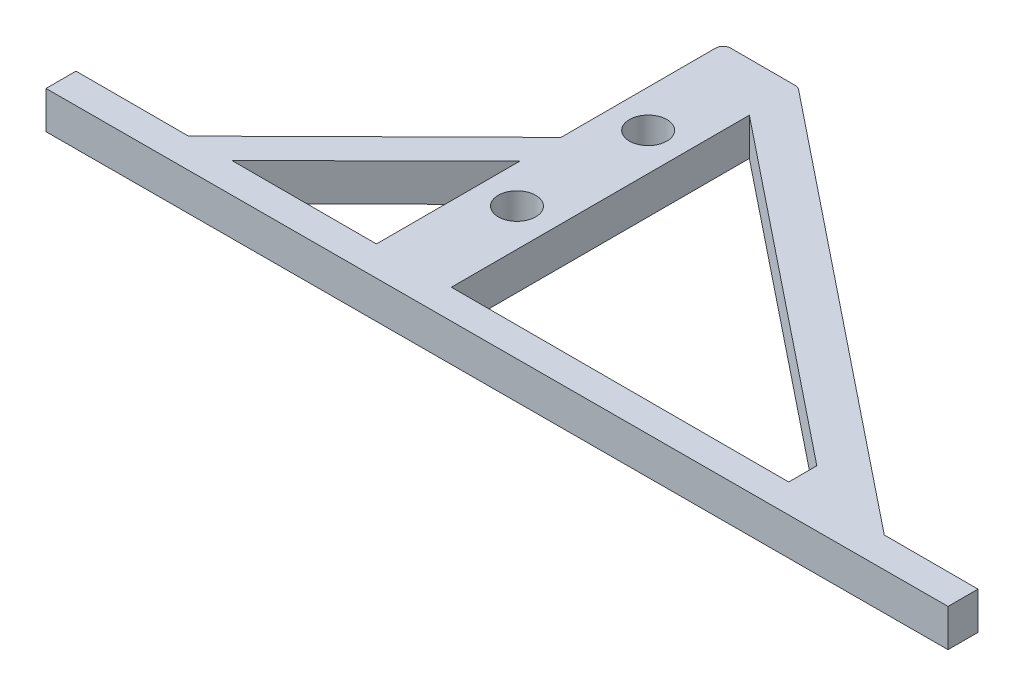
ISO-10303-21;
HEADER;
FILE_DESCRIPTION(('STEP AP214'),'2;1');
FILE_NAME('part.step','',(''),(''),'','','');
FILE_SCHEMA(('AUTOMOTIVE_DESIGN { 1 0 10303 214 1 1 1 1 }'));
ENDSEC;
DATA;
#1=APPLICATION_CONTEXT('core data for automotive mechanical design processes');
#2=APPLICATION_PROTOCOL_DEFINITION('international standard','automotive_design',2000,#1);
#3=PRODUCT_CONTEXT('',#1,'mechanical');
#4=PRODUCT('Part','Part','',(#3));
#5=PRODUCT_RELATED_PRODUCT_CATEGORY('part','',(#4));
#6=PRODUCT_DEFINITION_FORMATION('','',#4);
#7=PRODUCT_DEFINITION_CONTEXT('part definition',#1,'design');
#8=PRODUCT_DEFINITION('design','',#6,#7);
#9=PRODUCT_DEFINITION_SHAPE('','',#8);
#10=(LENGTH_UNIT() NAMED_UNIT(*) SI_UNIT(.MILLI.,.METRE.));
#11=(NAMED_UNIT(*) PLANE_ANGLE_UNIT() SI_UNIT($,.RADIAN.));
#12=(NAMED_UNIT(*) SI_UNIT($,.STERADIAN.) SOLID_ANGLE_UNIT());
#13=UNCERTAINTY_MEASURE_WITH_UNIT(LENGTH_MEASURE(1.E-05),#10,'distance_accuracy_value','');
#14=(GEOMETRIC_REPRESENTATION_CONTEXT(3) GLOBAL_UNCERTAINTY_ASSIGNED_CONTEXT((#13)) GLOBAL_UNIT_ASSIGNED_CONTEXT((#10,
#11,#12)) REPRESENTATION_CONTEXT('',''));
#15=CARTESIAN_POINT('',(0.,0.,0.));
#16=DIRECTION('',(0.,0.,1.));
#17=DIRECTION('',(1.,0.,0.));
#18=AXIS2_PLACEMENT_3D('',#15,#16,#17);
#19=CARTESIAN_POINT('',(24.5090161092301,12.7,-124.46));
#20=DIRECTION('',(0.,1.,0.));
#21=DIRECTION('',(0.,0.,1.));
#22=AXIS2_PLACEMENT_3D('',#19,#20,#21);
#23=PLANE('',#22);
#24=CARTESIAN_POINT('',(12.7,12.7,-44.45));
#25=DIRECTION('',(0.,1.,0.));
#26=DIRECTION('',(0.,0.,1.));
#27=AXIS2_PLACEMENT_3D('',#24,#25,#26);
#28=CIRCLE('',#27,6.35);
#29=CARTESIAN_POINT('',(12.7,12.7,-50.8));
#30=VERTEX_POINT('',#29);
#31=EDGE_CURVE('E224',#30,#30,#28,.T.);
#32=ORIENTED_EDGE('',*,*,#31,.F.);
#33=EDGE_LOOP('',(#32));
#34=FACE_BOUND('',#33,.T.);
#35=CARTESIAN_POINT('',(24.5090161092301,12.7,-124.46));
#36=DIRECTION('',(0.,1.,0.));
#37=DIRECTION('',(0.,0.,1.));
#38=AXIS2_PLACEMENT_3D('',#35,#36,#37);
#39=CIRCLE('',#38,2.54);
#40=CARTESIAN_POINT('',(26.0957415300184,12.7,-126.443406775985));
#41=VERTEX_POINT('',#40);
#42=CARTESIAN_POINT('',(24.5090161092301,12.7,-127.));
#43=VERTEX_POINT('',#42);
#44=EDGE_CURVE('E230',#41,#43,#39,.T.);
#45=ORIENTED_EDGE('',*,*,#44,.T.);
#46=DIRECTION('',(-1.,0.,0.));
#47=VECTOR('',#46,1.);
#48=CARTESIAN_POINT('',(2.54000000000002,12.7,-127.));
#49=LINE('',#48,#47);
#50=CARTESIAN_POINT('',(2.54,12.7,-127.));
#51=VERTEX_POINT('',#50);
#52=EDGE_CURVE('E233',#43,#51,#49,.T.);
#53=ORIENTED_EDGE('',*,*,#52,.T.);
#54=CARTESIAN_POINT('',(2.54,12.7,-124.46));
#55=DIRECTION('',(0.,1.,0.));
#56=DIRECTION('',(0.,0.,-1.));
#57=AXIS2_PLACEMENT_3D('',#54,#55,#56);
#58=CIRCLE('',#57,2.54);
#59=CARTESIAN_POINT('',(0.,12.7,-124.46));
#60=VERTEX_POINT('',#59);
#61=EDGE_CURVE('E236',#51,#60,#58,.T.);
#62=ORIENTED_EDGE('',*,*,#61,.T.);
#63=DIRECTION('',(0.,0.,1.));
#64=VECTOR('',#63,1.);
#65=CARTESIAN_POINT('',(0.,12.7,-72.0550274791085));
#66=LINE('',#65,#64);
#67=CARTESIAN_POINT('',(0.,12.7,-72.0550274791085));
#68=VERTEX_POINT('',#67);
#69=EDGE_CURVE('E238',#60,#68,#66,.T.);
#70=ORIENTED_EDGE('',*,*,#69,.T.);
#71=DIRECTION('',(-0.711451027338555,0.,0.702735679824865));
#72=VECTOR('',#71,1.);
#73=CARTESIAN_POINT('',(-63.5,12.7,-9.33290894368325));
#74=LINE('',#73,#72);
#75=CARTESIAN_POINT('',(-63.5,12.7,-9.33290894368325));
#76=VERTEX_POINT('',#75);
#77=EDGE_CURVE('E240',#68,#76,#74,.T.);
#78=ORIENTED_EDGE('',*,*,#77,.T.);
#79=DIRECTION('',(-1.,0.,0.));
#80=VECTOR('',#79,1.);
#81=CARTESIAN_POINT('',(-63.5,12.7,-9.33290894368325));
#82=LINE('',#81,#80);
#83=CARTESIAN_POINT('',(-101.6,12.7,-9.33290894368324));
#84=VERTEX_POINT('',#83);
#85=EDGE_CURVE('E242',#76,#84,#82,.T.);
#86=ORIENTED_EDGE('',*,*,#85,.T.);
#87=DIRECTION('',(0.,0.,1.));
#88=VECTOR('',#87,1.);
#89=CARTESIAN_POINT('',(-101.6,12.7,-9.33290894368324));
#90=LINE('',#89,#88);
#91=CARTESIAN_POINT('',(-101.6,12.7,0.827091056316761));
#92=VERTEX_POINT('',#91);
#93=EDGE_CURVE('E244',#84,#92,#90,.T.);
#94=ORIENTED_EDGE('',*,*,#93,.T.);
#95=DIRECTION('',(0.999996318334483,0.,-0.00271354334397683));
#96=VECTOR('',#95,1.);
#97=CARTESIAN_POINT('',(-101.6,12.7,0.827091056316761));
#98=LINE('',#97,#96);
#99=CARTESIAN_POINT('',(203.2,12.7,0.));
#100=VERTEX_POINT('',#99);
#101=EDGE_CURVE('E246',#92,#100,#98,.T.);
#102=ORIENTED_EDGE('',*,*,#101,.T.);
#103=DIRECTION('',(0.,0.,-1.));
#104=VECTOR('',#103,1.);
#105=CARTESIAN_POINT('',(203.2,12.7,0.));
#106=LINE('',#105,#104);
#107=CARTESIAN_POINT('',(203.2,12.7,-10.16));
#108=VERTEX_POINT('',#107);
#109=EDGE_CURVE('E248',#100,#108,#106,.T.);
#110=ORIENTED_EDGE('',*,*,#109,.T.);
#111=DIRECTION('',(-1.,0.,0.));
#112=VECTOR('',#111,1.);
#113=CARTESIAN_POINT('',(203.2,12.7,-10.16));
#114=LINE('',#113,#112);
#115=CARTESIAN_POINT('',(171.45,12.7,-10.16));
#116=VERTEX_POINT('',#115);
#117=EDGE_CURVE('E250',#108,#116,#114,.T.);
#118=ORIENTED_EDGE('',*,*,#117,.T.);
#119=DIRECTION('',(-0.78086880944303,0.,-0.624695047554424));
#120=VECTOR('',#119,1.);
#121=CARTESIAN_POINT('',(171.45,12.7,-10.16));
#122=LINE('',#121,#120);
#123=EDGE_CURVE('E252',#116,#41,#122,.T.);
#124=ORIENTED_EDGE('',*,*,#123,.T.);
#125=EDGE_LOOP('',(#45,#53,#62,#70,#78,#86,#94,#102,#110,#118,#124));
#126=FACE_BOUND('',#125,.T.);
#127=CARTESIAN_POINT('',(12.7,12.7,-88.9));
#128=DIRECTION('',(0.,1.,0.));
#129=DIRECTION('',(0.,0.,1.));
#130=AXIS2_PLACEMENT_3D('',#127,#128,#129);
#131=CIRCLE('',#130,6.35);
#132=CARTESIAN_POINT('',(12.7,12.7,-95.25));
#133=VERTEX_POINT('',#132);
#134=EDGE_CURVE('E218',#133,#133,#131,.T.);
#135=ORIENTED_EDGE('',*,*,#134,.F.);
#136=EDGE_LOOP('',(#135));
#137=FACE_BOUND('',#136,.T.);
#138=DIRECTION('',(0.,0.,-1.));
#139=VECTOR('',#138,1.);
#140=CARTESIAN_POINT('',(0.,12.7,-9.52499999999999));
#141=LINE('',#140,#139);
#142=CARTESIAN_POINT('',(0.,12.7,-9.52499999999999));
#143=VERTEX_POINT('',#142);
#144=CARTESIAN_POINT('',(0.,12.7,-58.0850274791085));
#145=VERTEX_POINT('',#144);
#146=EDGE_CURVE('E196',#143,#145,#141,.T.);
#147=ORIENTED_EDGE('',*,*,#146,.F.);
#148=DIRECTION('',(1.,0.,0.));
#149=VECTOR('',#148,1.);
#150=CARTESIAN_POINT('',(0.,12.7,-9.52499999999999));
#151=LINE('',#150,#149);
#152=CARTESIAN_POINT('',(-48.9620011163881,12.7,-9.52499999999999));
#153=VERTEX_POINT('',#152);
#154=EDGE_CURVE('E194',#153,#143,#151,.T.);
#155=ORIENTED_EDGE('',*,*,#154,.F.);
#156=DIRECTION('',(-0.710015355632729,0.,0.70418619325128));
#157=VECTOR('',#156,1.);
#158=CARTESIAN_POINT('',(-48.9620011163881,12.7,-9.52499999999999));
#159=LINE('',#158,#157);
#160=EDGE_CURVE('E200',#145,#153,#159,.T.);
#161=ORIENTED_EDGE('',*,*,#160,.F.);
#162=EDGE_LOOP('',(#147,#155,#161));
#163=FACE_BOUND('',#162,.T.);
#164=DIRECTION('',(0.,0.,1.));
#165=VECTOR('',#164,1.);
#166=CARTESIAN_POINT('',(25.4,12.7,-9.52499999999999));
#167=LINE('',#166,#165);
#168=CARTESIAN_POINT('',(25.4,12.7,-110.49));
#169=VERTEX_POINT('',#168);
#170=CARTESIAN_POINT('',(25.4,12.7,-9.52499999999999));
#171=VERTEX_POINT('',#170);
#172=EDGE_CURVE('E166',#169,#171,#167,.T.);
#173=ORIENTED_EDGE('',*,*,#172,.F.);
#174=DIRECTION('',(-0.78086880944303,0.,-0.624695047554424));
#175=VECTOR('',#174,1.);
#176=CARTESIAN_POINT('',(139.7,12.7,-19.05));
#177=LINE('',#176,#175);
#178=CARTESIAN_POINT('',(139.7,12.7,-19.05));
#179=VERTEX_POINT('',#178);
#180=EDGE_CURVE('E158',#179,#169,#177,.T.);
#181=ORIENTED_EDGE('',*,*,#180,.F.);
#182=DIRECTION('',(0.,0.,-1.));
#183=VECTOR('',#182,1.);
#184=CARTESIAN_POINT('',(139.7,12.7,-9.525));
#185=LINE('',#184,#183);
#186=CARTESIAN_POINT('',(139.7,12.7,-9.52499999999999));
#187=VERTEX_POINT('',#186);
#188=EDGE_CURVE('E180',#187,#179,#185,.T.);
#189=ORIENTED_EDGE('',*,*,#188,.F.);
#190=DIRECTION('',(1.,0.,0.));
#191=VECTOR('',#190,1.);
#192=CARTESIAN_POINT('',(139.7,12.7,-9.525));
#193=LINE('',#192,#191);
#194=EDGE_CURVE('E178',#171,#187,#193,.T.);
#195=ORIENTED_EDGE('',*,*,#194,.F.);
#196=EDGE_LOOP('',(#173,#181,#189,#195));
#197=FACE_BOUND('',#196,.T.);
#198=ADVANCED_FACE('F33',(#34,#126,#137,#163,#197),#23,.T.);
#199=CARTESIAN_POINT('',(24.5090161092301,0.,-124.46));
#200=DIRECTION('',(0.,1.,0.));
#201=DIRECTION('',(0.,0.,1.));
#202=AXIS2_PLACEMENT_3D('',#199,#200,#201);
#203=PLANE('',#202);
#204=DIRECTION('',(1.,0.,0.));
#205=VECTOR('',#204,1.);
#206=CARTESIAN_POINT('',(0.,0.,-9.52499999999999));
#207=LINE('',#206,#205);
#208=CARTESIAN_POINT('',(-48.9620011163881,0.,-9.52499999999998));
#209=VERTEX_POINT('',#208);
#210=CARTESIAN_POINT('',(0.,0.,-9.52499999999999));
#211=VERTEX_POINT('',#210);
#212=EDGE_CURVE('E174',#209,#211,#207,.T.);
#213=ORIENTED_EDGE('',*,*,#212,.T.);
#214=DIRECTION('',(0.,0.,-1.));
#215=VECTOR('',#214,1.);
#216=CARTESIAN_POINT('',(0.,0.,-9.52499999999999));
#217=LINE('',#216,#215);
#218=CARTESIAN_POINT('',(0.,0.,-58.0850274791085));
#219=VERTEX_POINT('',#218);
#220=EDGE_CURVE('E205',#211,#219,#217,.T.);
#221=ORIENTED_EDGE('',*,*,#220,.T.);
#222=DIRECTION('',(-0.710015355632729,0.,0.70418619325128));
#223=VECTOR('',#222,1.);
#224=CARTESIAN_POINT('',(-48.9620011163881,0.,-9.52499999999999));
#225=LINE('',#224,#223);
#226=EDGE_CURVE('E197',#219,#209,#225,.T.);
#227=ORIENTED_EDGE('',*,*,#226,.T.);
#228=EDGE_LOOP('',(#213,#221,#227));
#229=FACE_BOUND('',#228,.T.);
#230=CARTESIAN_POINT('',(24.5090161092301,0.,-124.46));
#231=DIRECTION('',(0.,1.,0.));
#232=DIRECTION('',(0.,0.,1.));
#233=AXIS2_PLACEMENT_3D('',#230,#231,#232);
#234=CIRCLE('',#233,2.54);
#235=CARTESIAN_POINT('',(26.0957415300184,0.,-126.443406775985));
#236=VERTEX_POINT('',#235);
#237=CARTESIAN_POINT('',(24.5090161092301,0.,-127.));
#238=VERTEX_POINT('',#237);
#239=EDGE_CURVE('E227',#236,#238,#234,.T.);
#240=ORIENTED_EDGE('',*,*,#239,.F.);
#241=DIRECTION('',(-0.78086880944303,0.,-0.624695047554424));
#242=VECTOR('',#241,1.);
#243=CARTESIAN_POINT('',(171.45,0.,-10.16));
#244=LINE('',#243,#242);
#245=CARTESIAN_POINT('',(171.45,0.,-10.16));
#246=VERTEX_POINT('',#245);
#247=EDGE_CURVE('E234',#246,#236,#244,.T.);
#248=ORIENTED_EDGE('',*,*,#247,.F.);
#249=DIRECTION('',(-1.,0.,0.));
#250=VECTOR('',#249,1.);
#251=CARTESIAN_POINT('',(203.2,0.,-10.16));
#252=LINE('',#251,#250);
#253=CARTESIAN_POINT('',(203.2,0.,-10.16));
#254=VERTEX_POINT('',#253);
#255=EDGE_CURVE('E273',#254,#246,#252,.T.);
#256=ORIENTED_EDGE('',*,*,#255,.F.);
#257=DIRECTION('',(0.,0.,-1.));
#258=VECTOR('',#257,1.);
#259=CARTESIAN_POINT('',(203.2,0.,0.));
#260=LINE('',#259,#258);
#261=CARTESIAN_POINT('',(203.2,0.,0.));
#262=VERTEX_POINT('',#261);
#263=EDGE_CURVE('E271',#262,#254,#260,.T.);
#264=ORIENTED_EDGE('',*,*,#263,.F.);
#265=DIRECTION('',(0.999996318334483,0.,-0.00271354334397683));
#266=VECTOR('',#265,1.);
#267=CARTESIAN_POINT('',(-101.6,0.,0.827091056316761));
#268=LINE('',#267,#266);
#269=CARTESIAN_POINT('',(-101.6,0.,0.827091056316761));
#270=VERTEX_POINT('',#269);
#271=EDGE_CURVE('E269',#270,#262,#268,.T.);
#272=ORIENTED_EDGE('',*,*,#271,.F.);
#273=DIRECTION('',(0.,0.,1.));
#274=VECTOR('',#273,1.);
#275=CARTESIAN_POINT('',(-101.6,0.,-9.33290894368324));
#276=LINE('',#275,#274);
#277=CARTESIAN_POINT('',(-101.6,0.,-9.33290894368324));
#278=VERTEX_POINT('',#277);
#279=EDGE_CURVE('E267',#278,#270,#276,.T.);
#280=ORIENTED_EDGE('',*,*,#279,.F.);
#281=DIRECTION('',(-1.,0.,0.));
#282=VECTOR('',#281,1.);
#283=CARTESIAN_POINT('',(-63.5,0.,-9.33290894368325));
#284=LINE('',#283,#282);
#285=CARTESIAN_POINT('',(-63.5,0.,-9.33290894368325));
#286=VERTEX_POINT('',#285);
#287=EDGE_CURVE('E265',#286,#278,#284,.T.);
#288=ORIENTED_EDGE('',*,*,#287,.F.);
#289=DIRECTION('',(-0.711451027338555,0.,0.702735679824865));
#290=VECTOR('',#289,1.);
#291=CARTESIAN_POINT('',(-63.5,0.,-9.33290894368325));
#292=LINE('',#291,#290);
#293=CARTESIAN_POINT('',(0.,0.,-72.0550274791085));
#294=VERTEX_POINT('',#293);
#295=EDGE_CURVE('E263',#294,#286,#292,.T.);
#296=ORIENTED_EDGE('',*,*,#295,.F.);
#297=DIRECTION('',(0.,0.,1.));
#298=VECTOR('',#297,1.);
#299=CARTESIAN_POINT('',(0.,0.,-72.0550274791085));
#300=LINE('',#299,#298);
#301=CARTESIAN_POINT('',(0.,0.,-124.46));
#302=VERTEX_POINT('',#301);
#303=EDGE_CURVE('E261',#302,#294,#300,.T.);
#304=ORIENTED_EDGE('',*,*,#303,.F.);
#305=CARTESIAN_POINT('',(2.54,0.,-124.46));
#306=DIRECTION('',(0.,1.,0.));
#307=DIRECTION('',(0.,0.,-1.));
#308=AXIS2_PLACEMENT_3D('',#305,#306,#307);
#309=CIRCLE('',#308,2.54);
#310=CARTESIAN_POINT('',(2.54,0.,-127.));
#311=VERTEX_POINT('',#310);
#312=EDGE_CURVE('E259',#311,#302,#309,.T.);
#313=ORIENTED_EDGE('',*,*,#312,.F.);
#314=DIRECTION('',(-1.,0.,0.));
#315=VECTOR('',#314,1.);
#316=CARTESIAN_POINT('',(2.54000000000002,0.,-127.));
#317=LINE('',#316,#315);
#318=EDGE_CURVE('E257',#238,#311,#317,.T.);
#319=ORIENTED_EDGE('',*,*,#318,.F.);
#320=EDGE_LOOP('',(#240,#248,#256,#264,#272,#280,#288,#296,#304,#313,#319));
#321=FACE_BOUND('',#320,.T.);
#322=CARTESIAN_POINT('',(12.7,0.,-44.45));
#323=DIRECTION('',(0.,1.,0.));
#324=DIRECTION('',(0.,0.,1.));
#325=AXIS2_PLACEMENT_3D('',#322,#323,#324);
#326=CIRCLE('',#325,6.35);
#327=CARTESIAN_POINT('',(12.7,0.,-50.8));
#328=VERTEX_POINT('',#327);
#329=EDGE_CURVE('E221',#328,#328,#326,.T.);
#330=ORIENTED_EDGE('',*,*,#329,.T.);
#331=EDGE_LOOP('',(#330));
#332=FACE_BOUND('',#331,.T.);
#333=CARTESIAN_POINT('',(12.7,0.,-88.9));
#334=DIRECTION('',(0.,1.,0.));
#335=DIRECTION('',(0.,0.,1.));
#336=AXIS2_PLACEMENT_3D('',#333,#334,#335);
#337=CIRCLE('',#336,6.35);
#338=CARTESIAN_POINT('',(12.7,0.,-95.25));
#339=VERTEX_POINT('',#338);
#340=EDGE_CURVE('E217',#339,#339,#337,.T.);
#341=ORIENTED_EDGE('',*,*,#340,.T.);
#342=EDGE_LOOP('',(#341));
#343=FACE_BOUND('',#342,.T.);
#344=DIRECTION('',(-0.78086880944303,0.,-0.624695047554424));
#345=VECTOR('',#344,1.);
#346=CARTESIAN_POINT('',(139.7,0.,-19.05));
#347=LINE('',#346,#345);
#348=CARTESIAN_POINT('',(139.7,0.,-19.05));
#349=VERTEX_POINT('',#348);
#350=CARTESIAN_POINT('',(25.4,0.,-110.49));
#351=VERTEX_POINT('',#350);
#352=EDGE_CURVE('E56',#349,#351,#347,.T.);
#353=ORIENTED_EDGE('',*,*,#352,.T.);
#354=DIRECTION('',(0.,0.,1.));
#355=VECTOR('',#354,1.);
#356=CARTESIAN_POINT('',(25.4,0.,-9.52499999999999));
#357=LINE('',#356,#355);
#358=CARTESIAN_POINT('',(25.4,0.,-9.52499999999999));
#359=VERTEX_POINT('',#358);
#360=EDGE_CURVE('E173',#351,#359,#357,.T.);
#361=ORIENTED_EDGE('',*,*,#360,.T.);
#362=DIRECTION('',(1.,0.,0.));
#363=VECTOR('',#362,1.);
#364=CARTESIAN_POINT('',(139.7,0.,-9.525));
#365=LINE('',#364,#363);
#366=CARTESIAN_POINT('',(139.7,0.,-9.525));
#367=VERTEX_POINT('',#366);
#368=EDGE_CURVE('E186',#359,#367,#365,.T.);
#369=ORIENTED_EDGE('',*,*,#368,.T.);
#370=DIRECTION('',(0.,0.,-1.));
#371=VECTOR('',#370,1.);
#372=CARTESIAN_POINT('',(139.7,0.,-9.525));
#373=LINE('',#372,#371);
#374=EDGE_CURVE('E167',#367,#349,#373,.T.);
#375=ORIENTED_EDGE('',*,*,#374,.T.);
#376=EDGE_LOOP('',(#353,#361,#369,#375));
#377=FACE_BOUND('',#376,.T.);
#378=ADVANCED_FACE('F312',(#229,#321,#332,#343,#377),#203,.F.);
#379=CARTESIAN_POINT('',(24.5090161092301,12.7,-124.46));
#380=DIRECTION('',(0.,-1.,0.));
#381=DIRECTION('',(0.,0.,-1.));
#382=AXIS2_PLACEMENT_3D('',#379,#380,#381);
#383=CYLINDRICAL_SURFACE('',#382,2.54);
#384=ORIENTED_EDGE('',*,*,#239,.T.);
#385=DIRECTION('',(0.,-1.,0.));
#386=VECTOR('',#385,1.);
#387=CARTESIAN_POINT('',(24.5090161092301,12.7,-127.));
#388=LINE('',#387,#386);
#389=EDGE_CURVE('E11',#43,#238,#388,.T.);
#390=ORIENTED_EDGE('',*,*,#389,.F.);
#391=ORIENTED_EDGE('',*,*,#44,.F.);
#392=DIRECTION('',(0.,-1.,0.));
#393=VECTOR('',#392,1.);
#394=CARTESIAN_POINT('',(26.0957415300184,12.7,-126.443406775985));
#395=LINE('',#394,#393);
#396=EDGE_CURVE('E254',#41,#236,#395,.T.);
#397=ORIENTED_EDGE('',*,*,#396,.T.);
#398=EDGE_LOOP('',(#384,#390,#391,#397));
#399=FACE_BOUND('',#398,.T.);
#400=ADVANCED_FACE('F35',(#399),#383,.T.);
#401=CARTESIAN_POINT('',(2.54000000000002,12.7,-127.));
#402=DIRECTION('',(0.,0.,1.));
#403=DIRECTION('',(1.,0.,0.));
#404=AXIS2_PLACEMENT_3D('',#401,#402,#403);
#405=PLANE('',#404);
#406=ORIENTED_EDGE('',*,*,#318,.T.);
#407=DIRECTION('',(0.,-1.,0.));
#408=VECTOR('',#407,1.);
#409=CARTESIAN_POINT('',(2.54,12.7,-127.));
#410=LINE('',#409,#408);
#411=EDGE_CURVE('E41',#51,#311,#410,.T.);
#412=ORIENTED_EDGE('',*,*,#411,.F.);
#413=ORIENTED_EDGE('',*,*,#52,.F.);
#414=ORIENTED_EDGE('',*,*,#389,.T.);
#415=EDGE_LOOP('',(#406,#412,#413,#414));
#416=FACE_BOUND('',#415,.T.);
#417=ADVANCED_FACE('F330',(#416),#405,.F.);
#418=CARTESIAN_POINT('',(2.54,12.7,-124.46));
#419=DIRECTION('',(0.,-1.,0.));
#420=DIRECTION('',(0.,0.,-1.));
#421=AXIS2_PLACEMENT_3D('',#418,#419,#420);
#422=CYLINDRICAL_SURFACE('',#421,2.54);
#423=ORIENTED_EDGE('',*,*,#312,.T.);
#424=DIRECTION('',(0.,-1.,0.));
#425=VECTOR('',#424,1.);
#426=CARTESIAN_POINT('',(0.,12.7,-124.46));
#427=LINE('',#426,#425);
#428=EDGE_CURVE('E299',#60,#302,#427,.T.);
#429=ORIENTED_EDGE('',*,*,#428,.F.);
#430=ORIENTED_EDGE('',*,*,#61,.F.);
#431=ORIENTED_EDGE('',*,*,#411,.T.);
#432=EDGE_LOOP('',(#423,#429,#430,#431));
#433=FACE_BOUND('',#432,.T.);
#434=ADVANCED_FACE('F306',(#433),#422,.T.);
#435=CARTESIAN_POINT('',(0.,12.7,-72.0550274791085));
#436=DIRECTION('',(1.,0.,0.));
#437=DIRECTION('',(0.,0.,-1.));
#438=AXIS2_PLACEMENT_3D('',#435,#436,#437);
#439=PLANE('',#438);
#440=ORIENTED_EDGE('',*,*,#303,.T.);
#441=DIRECTION('',(0.,-1.,0.));
#442=VECTOR('',#441,1.);
#443=CARTESIAN_POINT('',(0.,12.7,-72.0550274791085));
#444=LINE('',#443,#442);
#445=EDGE_CURVE('E296',#68,#294,#444,.T.);
#446=ORIENTED_EDGE('',*,*,#445,.F.);
#447=ORIENTED_EDGE('',*,*,#69,.F.);
#448=ORIENTED_EDGE('',*,*,#428,.T.);
#449=EDGE_LOOP('',(#440,#446,#447,#448));
#450=FACE_BOUND('',#449,.T.);
#451=ADVANCED_FACE('F318',(#450),#439,.F.);
#452=CARTESIAN_POINT('',(-63.5,12.7,-9.33290894368325));
#453=DIRECTION('',(0.702735679824865,0.,0.711451027338555));
#454=DIRECTION('',(0.711451027338555,0.,-0.702735679824865));
#455=AXIS2_PLACEMENT_3D('',#452,#453,#454);
#456=PLANE('',#455);
#457=ORIENTED_EDGE('',*,*,#295,.T.);
#458=DIRECTION('',(0.,-1.,0.));
#459=VECTOR('',#458,1.);
#460=CARTESIAN_POINT('',(-63.5,12.7,-9.33290894368325));
#461=LINE('',#460,#459);
#462=EDGE_CURVE('E293',#76,#286,#461,.T.);
#463=ORIENTED_EDGE('',*,*,#462,.F.);
#464=ORIENTED_EDGE('',*,*,#77,.F.);
#465=ORIENTED_EDGE('',*,*,#445,.T.);
#466=EDGE_LOOP('',(#457,#463,#464,#465));
#467=FACE_BOUND('',#466,.T.);
#468=ADVANCED_FACE('F322',(#467),#456,.F.);
#469=CARTESIAN_POINT('',(-63.5,12.7,-9.33290894368325));
#470=DIRECTION('',(0.,0.,1.));
#471=DIRECTION('',(1.,0.,0.));
#472=AXIS2_PLACEMENT_3D('',#469,#470,#471);
#473=PLANE('',#472);
#474=ORIENTED_EDGE('',*,*,#287,.T.);
#475=DIRECTION('',(0.,-1.,0.));
#476=VECTOR('',#475,1.);
#477=CARTESIAN_POINT('',(-101.6,12.7,-9.33290894368324));
#478=LINE('',#477,#476);
#479=EDGE_CURVE('E290',#84,#278,#478,.T.);
#480=ORIENTED_EDGE('',*,*,#479,.F.);
#481=ORIENTED_EDGE('',*,*,#85,.F.);
#482=ORIENTED_EDGE('',*,*,#462,.T.);
#483=EDGE_LOOP('',(#474,#480,#481,#482));
#484=FACE_BOUND('',#483,.T.);
#485=ADVANCED_FACE('F358',(#484),#473,.F.);
#486=CARTESIAN_POINT('',(-101.6,12.7,-9.33290894368324));
#487=DIRECTION('',(1.,0.,0.));
#488=DIRECTION('',(0.,0.,-1.));
#489=AXIS2_PLACEMENT_3D('',#486,#487,#488);
#490=PLANE('',#489);
#491=ORIENTED_EDGE('',*,*,#279,.T.);
#492=DIRECTION('',(0.,-1.,0.));
#493=VECTOR('',#492,1.);
#494=CARTESIAN_POINT('',(-101.6,12.7,0.827091056316761));
#495=LINE('',#494,#493);
#496=EDGE_CURVE('E287',#92,#270,#495,.T.);
#497=ORIENTED_EDGE('',*,*,#496,.F.);
#498=ORIENTED_EDGE('',*,*,#93,.F.);
#499=ORIENTED_EDGE('',*,*,#479,.T.);
#500=EDGE_LOOP('',(#491,#497,#498,#499));
#501=FACE_BOUND('',#500,.T.);
#502=ADVANCED_FACE('F356',(#501),#490,.F.);
#503=CARTESIAN_POINT('',(-101.6,12.7,0.827091056316761));
#504=DIRECTION('',(-0.00271354334397683,0.,-0.999996318334483));
#505=DIRECTION('',(-0.999996318334483,0.,0.00271354334397683));
#506=AXIS2_PLACEMENT_3D('',#503,#504,#505);
#507=PLANE('',#506);
#508=ORIENTED_EDGE('',*,*,#271,.T.);
#509=DIRECTION('',(0.,-1.,0.));
#510=VECTOR('',#509,1.);
#511=CARTESIAN_POINT('',(203.2,12.7,0.));
#512=LINE('',#511,#510);
#513=EDGE_CURVE('E284',#100,#262,#512,.T.);
#514=ORIENTED_EDGE('',*,*,#513,.F.);
#515=ORIENTED_EDGE('',*,*,#101,.F.);
#516=ORIENTED_EDGE('',*,*,#496,.T.);
#517=EDGE_LOOP('',(#508,#514,#515,#516));
#518=FACE_BOUND('',#517,.T.);
#519=ADVANCED_FACE('F351',(#518),#507,.F.);
#520=CARTESIAN_POINT('',(203.2,12.7,0.));
#521=DIRECTION('',(-1.,0.,0.));
#522=DIRECTION('',(0.,0.,1.));
#523=AXIS2_PLACEMENT_3D('',#520,#521,#522);
#524=PLANE('',#523);
#525=ORIENTED_EDGE('',*,*,#263,.T.);
#526=DIRECTION('',(0.,-1.,0.));
#527=VECTOR('',#526,1.);
#528=CARTESIAN_POINT('',(203.2,12.7,-10.16));
#529=LINE('',#528,#527);
#530=EDGE_CURVE('E281',#108,#254,#529,.T.);
#531=ORIENTED_EDGE('',*,*,#530,.F.);
#532=ORIENTED_EDGE('',*,*,#109,.F.);
#533=ORIENTED_EDGE('',*,*,#513,.T.);
#534=EDGE_LOOP('',(#525,#531,#532,#533));
#535=FACE_BOUND('',#534,.T.);
#536=ADVANCED_FACE('F346',(#535),#524,.F.);
#537=CARTESIAN_POINT('',(203.2,12.7,-10.16));
#538=DIRECTION('',(0.,0.,1.));
#539=DIRECTION('',(1.,0.,0.));
#540=AXIS2_PLACEMENT_3D('',#537,#538,#539);
#541=PLANE('',#540);
#542=ORIENTED_EDGE('',*,*,#255,.T.);
#543=DIRECTION('',(0.,-1.,0.));
#544=VECTOR('',#543,1.);
#545=CARTESIAN_POINT('',(171.45,12.7,-10.16));
#546=LINE('',#545,#544);
#547=EDGE_CURVE('E278',#116,#246,#546,.T.);
#548=ORIENTED_EDGE('',*,*,#547,.F.);
#549=ORIENTED_EDGE('',*,*,#117,.F.);
#550=ORIENTED_EDGE('',*,*,#530,.T.);
#551=EDGE_LOOP('',(#542,#548,#549,#550));
#552=FACE_BOUND('',#551,.T.);
#553=ADVANCED_FACE('F342',(#552),#541,.F.);
#554=CARTESIAN_POINT('',(171.45,12.7,-10.16));
#555=DIRECTION('',(-0.624695047554424,0.,0.78086880944303));
#556=DIRECTION('',(0.78086880944303,0.,0.624695047554424));
#557=AXIS2_PLACEMENT_3D('',#554,#555,#556);
#558=PLANE('',#557);
#559=ORIENTED_EDGE('',*,*,#247,.T.);
#560=ORIENTED_EDGE('',*,*,#396,.F.);
#561=ORIENTED_EDGE('',*,*,#123,.F.);
#562=ORIENTED_EDGE('',*,*,#547,.T.);
#563=EDGE_LOOP('',(#559,#560,#561,#562));
#564=FACE_BOUND('',#563,.T.);
#565=ADVANCED_FACE('F337',(#564),#558,.F.);
#566=CARTESIAN_POINT('',(12.7,12.7,-44.45));
#567=DIRECTION('',(0.,-1.,0.));
#568=DIRECTION('',(0.,0.,-1.));
#569=AXIS2_PLACEMENT_3D('',#566,#567,#568);
#570=CYLINDRICAL_SURFACE('',#569,6.35);
#571=CARTESIAN_POINT('',(12.7,12.7,-50.8));
#572=CARTESIAN_POINT('',(12.7,12.5677083333333,-50.8));
#573=CARTESIAN_POINT('',(12.7,12.4354166666667,-50.8));
#574=CARTESIAN_POINT('',(12.7,12.1708333333333,-50.8));
#575=CARTESIAN_POINT('',(12.7,12.0385416666667,-50.8));
#576=CARTESIAN_POINT('',(12.7,11.7739583333333,-50.8));
#577=CARTESIAN_POINT('',(12.7,11.6416666666667,-50.8));
#578=CARTESIAN_POINT('',(12.7,11.3770833333333,-50.8));
#579=CARTESIAN_POINT('',(12.7,11.2447916666667,-50.8));
#580=CARTESIAN_POINT('',(12.7,10.9802083333333,-50.8));
#581=CARTESIAN_POINT('',(12.7,10.8479166666667,-50.8));
#582=CARTESIAN_POINT('',(12.7,10.5833333333333,-50.8));
#583=CARTESIAN_POINT('',(12.7,10.4510416666667,-50.8));
#584=CARTESIAN_POINT('',(12.7,10.1864583333333,-50.8));
#585=CARTESIAN_POINT('',(12.7,10.0541666666667,-50.8));
#586=CARTESIAN_POINT('',(12.7,9.78958333333333,-50.8));
#587=CARTESIAN_POINT('',(12.7,9.65729166666667,-50.8));
#588=CARTESIAN_POINT('',(12.7,9.39270833333333,-50.8));
#589=CARTESIAN_POINT('',(12.7,9.26041666666667,-50.8));
#590=CARTESIAN_POINT('',(12.7,8.99583333333333,-50.8));
#591=CARTESIAN_POINT('',(12.7,8.86354166666667,-50.8));
#592=CARTESIAN_POINT('',(12.7,8.59895833333333,-50.8));
#593=CARTESIAN_POINT('',(12.7,8.46666666666667,-50.8));
#594=CARTESIAN_POINT('',(12.7,8.20208333333333,-50.8));
#595=CARTESIAN_POINT('',(12.7,8.06979166666667,-50.8));
#596=CARTESIAN_POINT('',(12.7,7.80520833333333,-50.8));
#597=CARTESIAN_POINT('',(12.7,7.67291666666667,-50.8));
#598=CARTESIAN_POINT('',(12.7,7.40833333333333,-50.8));
#599=CARTESIAN_POINT('',(12.7,7.27604166666667,-50.8));
#600=CARTESIAN_POINT('',(12.7,7.01145833333333,-50.8));
#601=CARTESIAN_POINT('',(12.7,6.87916666666667,-50.8));
#602=CARTESIAN_POINT('',(12.7,6.61458333333333,-50.8));
#603=CARTESIAN_POINT('',(12.7,6.48229166666667,-50.8));
#604=CARTESIAN_POINT('',(12.7,6.21770833333333,-50.8));
#605=CARTESIAN_POINT('',(12.7,6.08541666666667,-50.8));
#606=CARTESIAN_POINT('',(12.7,5.82083333333333,-50.8));
#607=CARTESIAN_POINT('',(12.7,5.68854166666667,-50.8));
#608=CARTESIAN_POINT('',(12.7,5.42395833333333,-50.8));
#609=CARTESIAN_POINT('',(12.7,5.29166666666667,-50.8));
#610=CARTESIAN_POINT('',(12.7,5.02708333333333,-50.8));
#611=CARTESIAN_POINT('',(12.7,4.89479166666667,-50.8));
#612=CARTESIAN_POINT('',(12.7,4.63020833333333,-50.8));
#613=CARTESIAN_POINT('',(12.7,4.49791666666667,-50.8));
#614=CARTESIAN_POINT('',(12.7,4.23333333333333,-50.8));
#615=CARTESIAN_POINT('',(12.7,4.10104166666667,-50.8));
#616=CARTESIAN_POINT('',(12.7,3.83645833333333,-50.8));
#617=CARTESIAN_POINT('',(12.7,3.70416666666667,-50.8));
#618=CARTESIAN_POINT('',(12.7,3.43958333333333,-50.8));
#619=CARTESIAN_POINT('',(12.7,3.30729166666667,-50.8));
#620=CARTESIAN_POINT('',(12.7,3.04270833333333,-50.8));
#621=CARTESIAN_POINT('',(12.7,2.91041666666667,-50.8));
#622=CARTESIAN_POINT('',(12.7,2.64583333333333,-50.8));
#623=CARTESIAN_POINT('',(12.7,2.51354166666667,-50.8));
#624=CARTESIAN_POINT('',(12.7,2.24895833333333,-50.8));
#625=CARTESIAN_POINT('',(12.7,2.11666666666667,-50.8));
#626=CARTESIAN_POINT('',(12.7,1.85208333333333,-50.8));
#627=CARTESIAN_POINT('',(12.7,1.71979166666667,-50.8));
#628=CARTESIAN_POINT('',(12.7,1.45520833333333,-50.8));
#629=CARTESIAN_POINT('',(12.7,1.32291666666667,-50.8));
#630=CARTESIAN_POINT('',(12.7,1.05833333333333,-50.8));
#631=CARTESIAN_POINT('',(12.7,0.926041666666666,-50.8));
#632=CARTESIAN_POINT('',(12.7,0.661458333333333,-50.8));
#633=CARTESIAN_POINT('',(12.7,0.529166666666666,-50.8));
#634=CARTESIAN_POINT('',(12.7,0.264583333333333,-50.8));
#635=CARTESIAN_POINT('',(12.7,0.132291666666667,-50.8));
#636=CARTESIAN_POINT('',(12.7,0.,-50.8));
#637=B_SPLINE_CURVE_WITH_KNOTS('',3,(#571,#572,#573,#574,#575,#576,#577,#578,#579,#580,#581,
#582,#583,#584,#585,#586,#587,#588,#589,#590,#591,#592,#593,#594,#595,#596,#597,#598,#599,#600,
#601,#602,#603,#604,#605,#606,#607,#608,#609,#610,#611,#612,#613,#614,#615,#616,#617,#618,#619,
#620,#621,#622,#623,#624,#625,#626,#627,#628,#629,#630,#631,#632,#633,#634,#635,#636),
.UNSPECIFIED.,.F.,.F.,(4,2,2,2,2,2,2,2,2,2,2,2,2,2,2,2,2,2,2,2,2,2,2,2,2,2,2,2,2,2,2,2,4),(0.,
0.396875000000001,0.793750000000001,1.190625,1.5875,1.984375,2.38125,2.778125,3.175,3.571875,
3.96875,4.365625,4.7625,5.159375,5.55625,5.953125,6.35,6.746875,7.14375,7.540625,7.9375,
8.334375,8.73125,9.128125,9.525,9.921875,10.31875,10.715625,11.1125,11.509375,11.90625,
12.303125,12.7),.UNSPECIFIED.);
#638=EDGE_CURVE('BSEAM377',#30,#328,#637,.T.);
#639=ORIENTED_EDGE('',*,*,#31,.T.);
#640=ORIENTED_EDGE('',*,*,#329,.F.);
#641=ORIENTED_EDGE('',*,*,#638,.T.);
#642=ORIENTED_EDGE('',*,*,#638,.F.);
#643=EDGE_LOOP('',(#639,#641,#640,#642));
#644=FACE_BOUND('',#643,.T.);
#645=ADVANCED_FACE('F377',(#644),#570,.F.);
#646=CARTESIAN_POINT('',(12.7,12.7,-88.9));
#647=DIRECTION('',(0.,-1.,0.));
#648=DIRECTION('',(0.,0.,-1.));
#649=AXIS2_PLACEMENT_3D('',#646,#647,#648);
#650=CYLINDRICAL_SURFACE('',#649,6.35);
#651=CARTESIAN_POINT('',(12.7,12.7,-95.25));
#652=CARTESIAN_POINT('',(12.7,12.5677083333333,-95.25));
#653=CARTESIAN_POINT('',(12.7,12.4354166666667,-95.25));
#654=CARTESIAN_POINT('',(12.7,12.1708333333333,-95.25));
#655=CARTESIAN_POINT('',(12.7,12.0385416666667,-95.25));
#656=CARTESIAN_POINT('',(12.7,11.7739583333333,-95.25));
#657=CARTESIAN_POINT('',(12.7,11.6416666666667,-95.25));
#658=CARTESIAN_POINT('',(12.7,11.3770833333333,-95.25));
#659=CARTESIAN_POINT('',(12.7,11.2447916666667,-95.25));
#660=CARTESIAN_POINT('',(12.7,10.9802083333333,-95.25));
#661=CARTESIAN_POINT('',(12.7,10.8479166666667,-95.25));
#662=CARTESIAN_POINT('',(12.7,10.5833333333333,-95.25));
#663=CARTESIAN_POINT('',(12.7,10.4510416666667,-95.25));
#664=CARTESIAN_POINT('',(12.7,10.1864583333333,-95.25));
#665=CARTESIAN_POINT('',(12.7,10.0541666666667,-95.25));
#666=CARTESIAN_POINT('',(12.7,9.78958333333333,-95.25));
#667=CARTESIAN_POINT('',(12.7,9.65729166666667,-95.25));
#668=CARTESIAN_POINT('',(12.7,9.39270833333333,-95.25));
#669=CARTESIAN_POINT('',(12.7,9.26041666666667,-95.25));
#670=CARTESIAN_POINT('',(12.7,8.99583333333333,-95.25));
#671=CARTESIAN_POINT('',(12.7,8.86354166666667,-95.25));
#672=CARTESIAN_POINT('',(12.7,8.59895833333333,-95.25));
#673=CARTESIAN_POINT('',(12.7,8.46666666666667,-95.25));
#674=CARTESIAN_POINT('',(12.7,8.20208333333333,-95.25));
#675=CARTESIAN_POINT('',(12.7,8.06979166666667,-95.25));
#676=CARTESIAN_POINT('',(12.7,7.80520833333333,-95.25));
#677=CARTESIAN_POINT('',(12.7,7.67291666666667,-95.25));
#678=CARTESIAN_POINT('',(12.7,7.40833333333333,-95.25));
#679=CARTESIAN_POINT('',(12.7,7.27604166666667,-95.25));
#680=CARTESIAN_POINT('',(12.7,7.01145833333333,-95.25));
#681=CARTESIAN_POINT('',(12.7,6.87916666666667,-95.25));
#682=CARTESIAN_POINT('',(12.7,6.61458333333333,-95.25));
#683=CARTESIAN_POINT('',(12.7,6.48229166666667,-95.25));
#684=CARTESIAN_POINT('',(12.7,6.21770833333333,-95.25));
#685=CARTESIAN_POINT('',(12.7,6.08541666666667,-95.25));
#686=CARTESIAN_POINT('',(12.7,5.82083333333333,-95.25));
#687=CARTESIAN_POINT('',(12.7,5.68854166666667,-95.25));
#688=CARTESIAN_POINT('',(12.7,5.42395833333333,-95.25));
#689=CARTESIAN_POINT('',(12.7,5.29166666666667,-95.25));
#690=CARTESIAN_POINT('',(12.7,5.02708333333333,-95.25));
#691=CARTESIAN_POINT('',(12.7,4.89479166666667,-95.25));
#692=CARTESIAN_POINT('',(12.7,4.63020833333333,-95.25));
#693=CARTESIAN_POINT('',(12.7,4.49791666666667,-95.25));
#694=CARTESIAN_POINT('',(12.7,4.23333333333333,-95.25));
#695=CARTESIAN_POINT('',(12.7,4.10104166666667,-95.25));
#696=CARTESIAN_POINT('',(12.7,3.83645833333333,-95.25));
#697=CARTESIAN_POINT('',(12.7,3.70416666666667,-95.25));
#698=CARTESIAN_POINT('',(12.7,3.43958333333333,-95.25));
#699=CARTESIAN_POINT('',(12.7,3.30729166666667,-95.25));
#700=CARTESIAN_POINT('',(12.7,3.04270833333333,-95.25));
#701=CARTESIAN_POINT('',(12.7,2.91041666666667,-95.25));
#702=CARTESIAN_POINT('',(12.7,2.64583333333333,-95.25));
#703=CARTESIAN_POINT('',(12.7,2.51354166666667,-95.25));
#704=CARTESIAN_POINT('',(12.7,2.24895833333333,-95.25));
#705=CARTESIAN_POINT('',(12.7,2.11666666666667,-95.25));
#706=CARTESIAN_POINT('',(12.7,1.85208333333333,-95.25));
#707=CARTESIAN_POINT('',(12.7,1.71979166666667,-95.25));
#708=CARTESIAN_POINT('',(12.7,1.45520833333333,-95.25));
#709=CARTESIAN_POINT('',(12.7,1.32291666666667,-95.25));
#710=CARTESIAN_POINT('',(12.7,1.05833333333333,-95.25));
#711=CARTESIAN_POINT('',(12.7,0.926041666666666,-95.25));
#712=CARTESIAN_POINT('',(12.7,0.661458333333333,-95.25));
#713=CARTESIAN_POINT('',(12.7,0.529166666666666,-95.25));
#714=CARTESIAN_POINT('',(12.7,0.264583333333333,-95.25));
#715=CARTESIAN_POINT('',(12.7,0.132291666666667,-95.25));
#716=CARTESIAN_POINT('',(12.7,0.,-95.25));
#717=B_SPLINE_CURVE_WITH_KNOTS('',3,(#651,#652,#653,#654,#655,#656,#657,#658,#659,#660,#661,
#662,#663,#664,#665,#666,#667,#668,#669,#670,#671,#672,#673,#674,#675,#676,#677,#678,#679,#680,
#681,#682,#683,#684,#685,#686,#687,#688,#689,#690,#691,#692,#693,#694,#695,#696,#697,#698,#699,
#700,#701,#702,#703,#704,#705,#706,#707,#708,#709,#710,#711,#712,#713,#714,#715,#716),
.UNSPECIFIED.,.F.,.F.,(4,2,2,2,2,2,2,2,2,2,2,2,2,2,2,2,2,2,2,2,2,2,2,2,2,2,2,2,2,2,2,2,4),(0.,
0.396875000000001,0.793750000000001,1.190625,1.5875,1.984375,2.38125,2.778125,3.175,3.571875,
3.96875,4.365625,4.7625,5.159375,5.55625,5.953125,6.35,6.746875,7.14375,7.540625,7.9375,
8.334375,8.73125,9.128125,9.525,9.921875,10.31875,10.715625,11.1125,11.509375,11.90625,
12.303125,12.7),.UNSPECIFIED.);
#718=EDGE_CURVE('BSEAM409',#133,#339,#717,.T.);
#719=ORIENTED_EDGE('',*,*,#134,.T.);
#720=ORIENTED_EDGE('',*,*,#340,.F.);
#721=ORIENTED_EDGE('',*,*,#718,.T.);
#722=ORIENTED_EDGE('',*,*,#718,.F.);
#723=EDGE_LOOP('',(#719,#721,#720,#722));
#724=FACE_BOUND('',#723,.T.);
#725=ADVANCED_FACE('F409',(#724),#650,.F.);
#726=CARTESIAN_POINT('',(0.,12.7,-9.52499999999999));
#727=DIRECTION('',(0.,0.,-1.));
#728=DIRECTION('',(-1.,0.,0.));
#729=AXIS2_PLACEMENT_3D('',#726,#727,#728);
#730=PLANE('',#729);
#731=ORIENTED_EDGE('',*,*,#212,.F.);
#732=DIRECTION('',(0.,-1.,0.));
#733=VECTOR('',#732,1.);
#734=CARTESIAN_POINT('',(-48.9620011163881,12.7,-9.52499999999999));
#735=LINE('',#734,#733);
#736=EDGE_CURVE('E202',#153,#209,#735,.T.);
#737=ORIENTED_EDGE('',*,*,#736,.F.);
#738=ORIENTED_EDGE('',*,*,#154,.T.);
#739=DIRECTION('',(0.,-1.,0.));
#740=VECTOR('',#739,1.);
#741=CARTESIAN_POINT('',(0.,12.7,-9.52499999999999));
#742=LINE('',#741,#740);
#743=EDGE_CURVE('E214',#143,#211,#742,.T.);
#744=ORIENTED_EDGE('',*,*,#743,.T.);
#745=EDGE_LOOP('',(#731,#737,#738,#744));
#746=FACE_BOUND('',#745,.T.);
#747=ADVANCED_FACE('F416',(#746),#730,.T.);
#748=CARTESIAN_POINT('',(0.,12.7,-9.52499999999999));
#749=DIRECTION('',(-1.,0.,0.));
#750=DIRECTION('',(0.,0.,1.));
#751=AXIS2_PLACEMENT_3D('',#748,#749,#750);
#752=PLANE('',#751);
#753=ORIENTED_EDGE('',*,*,#220,.F.);
#754=ORIENTED_EDGE('',*,*,#743,.F.);
#755=ORIENTED_EDGE('',*,*,#146,.T.);
#756=DIRECTION('',(0.,-1.,0.));
#757=VECTOR('',#756,1.);
#758=CARTESIAN_POINT('',(0.,12.7,-58.0850274791085));
#759=LINE('',#758,#757);
#760=EDGE_CURVE('E212',#145,#219,#759,.T.);
#761=ORIENTED_EDGE('',*,*,#760,.T.);
#762=EDGE_LOOP('',(#753,#754,#755,#761));
#763=FACE_BOUND('',#762,.T.);
#764=ADVANCED_FACE('F423',(#763),#752,.T.);
#765=CARTESIAN_POINT('',(-48.9620011163881,12.7,-9.52499999999999));
#766=DIRECTION('',(0.70418619325128,0.,0.710015355632729));
#767=DIRECTION('',(0.710015355632729,0.,-0.70418619325128));
#768=AXIS2_PLACEMENT_3D('',#765,#766,#767);
#769=PLANE('',#768);
#770=ORIENTED_EDGE('',*,*,#226,.F.);
#771=ORIENTED_EDGE('',*,*,#760,.F.);
#772=ORIENTED_EDGE('',*,*,#160,.T.);
#773=ORIENTED_EDGE('',*,*,#736,.T.);
#774=EDGE_LOOP('',(#770,#771,#772,#773));
#775=FACE_BOUND('',#774,.T.);
#776=ADVANCED_FACE('F431',(#775),#769,.T.);
#777=CARTESIAN_POINT('',(139.7,12.7,-19.05));
#778=DIRECTION('',(-0.624695047554424,0.,0.78086880944303));
#779=DIRECTION('',(0.78086880944303,0.,0.624695047554424));
#780=AXIS2_PLACEMENT_3D('',#777,#778,#779);
#781=PLANE('',#780);
#782=ORIENTED_EDGE('',*,*,#352,.F.);
#783=DIRECTION('',(0.,-1.,0.));
#784=VECTOR('',#783,1.);
#785=CARTESIAN_POINT('',(139.7,12.7,-19.05));
#786=LINE('',#785,#784);
#787=EDGE_CURVE('E162',#179,#349,#786,.T.);
#788=ORIENTED_EDGE('',*,*,#787,.F.);
#789=ORIENTED_EDGE('',*,*,#180,.T.);
#790=DIRECTION('',(0.,-1.,0.));
#791=VECTOR('',#790,1.);
#792=CARTESIAN_POINT('',(25.4,12.7,-110.49));
#793=LINE('',#792,#791);
#794=EDGE_CURVE('E161',#169,#351,#793,.T.);
#795=ORIENTED_EDGE('',*,*,#794,.T.);
#796=EDGE_LOOP('',(#782,#788,#789,#795));
#797=FACE_BOUND('',#796,.T.);
#798=ADVANCED_FACE('F160',(#797),#781,.T.);
#799=CARTESIAN_POINT('',(25.4,12.7,-9.52499999999999));
#800=DIRECTION('',(1.,0.,0.));
#801=DIRECTION('',(0.,0.,-1.));
#802=AXIS2_PLACEMENT_3D('',#799,#800,#801);
#803=PLANE('',#802);
#804=ORIENTED_EDGE('',*,*,#360,.F.);
#805=ORIENTED_EDGE('',*,*,#794,.F.);
#806=ORIENTED_EDGE('',*,*,#172,.T.);
#807=DIRECTION('',(0.,-1.,0.));
#808=VECTOR('',#807,1.);
#809=CARTESIAN_POINT('',(25.4,12.7,-9.52499999999999));
#810=LINE('',#809,#808);
#811=EDGE_CURVE('E175',#171,#359,#810,.T.);
#812=ORIENTED_EDGE('',*,*,#811,.T.);
#813=EDGE_LOOP('',(#804,#805,#806,#812));
#814=FACE_BOUND('',#813,.T.);
#815=ADVANCED_FACE('F170',(#814),#803,.T.);
#816=CARTESIAN_POINT('',(139.7,12.7,-9.525));
#817=DIRECTION('',(0.,0.,-1.));
#818=DIRECTION('',(-1.,0.,0.));
#819=AXIS2_PLACEMENT_3D('',#816,#817,#818);
#820=PLANE('',#819);
#821=ORIENTED_EDGE('',*,*,#368,.F.);
#822=ORIENTED_EDGE('',*,*,#811,.F.);
#823=ORIENTED_EDGE('',*,*,#194,.T.);
#824=DIRECTION('',(0.,-1.,0.));
#825=VECTOR('',#824,1.);
#826=CARTESIAN_POINT('',(139.7,12.7,-9.525));
#827=LINE('',#826,#825);
#828=EDGE_CURVE('E48',#187,#367,#827,.T.);
#829=ORIENTED_EDGE('',*,*,#828,.T.);
#830=EDGE_LOOP('',(#821,#822,#823,#829));
#831=FACE_BOUND('',#830,.T.);
#832=ADVANCED_FACE('F452',(#831),#820,.T.);
#833=CARTESIAN_POINT('',(139.7,12.7,-9.525));
#834=DIRECTION('',(-1.,0.,0.));
#835=DIRECTION('',(0.,0.,1.));
#836=AXIS2_PLACEMENT_3D('',#833,#834,#835);
#837=PLANE('',#836);
#838=ORIENTED_EDGE('',*,*,#374,.F.);
#839=ORIENTED_EDGE('',*,*,#828,.F.);
#840=ORIENTED_EDGE('',*,*,#188,.T.);
#841=ORIENTED_EDGE('',*,*,#787,.T.);
#842=EDGE_LOOP('',(#838,#839,#840,#841));
#843=FACE_BOUND('',#842,.T.);
#844=ADVANCED_FACE('F459',(#843),#837,.T.);
#845=CLOSED_SHELL('',(#198,#378,#400,#417,#434,#451,#468,#485,#502,#519,#536,#553,#565,#645,
#725,#747,#764,#776,#798,#815,#832,#844));
#846=MANIFOLD_SOLID_BREP('B2',#845);
#847=ADVANCED_BREP_SHAPE_REPRESENTATION('',(#18,#846),#14);
#848=SHAPE_DEFINITION_REPRESENTATION(#9,#847);
ENDSEC;
END-ISO-10303-21;
